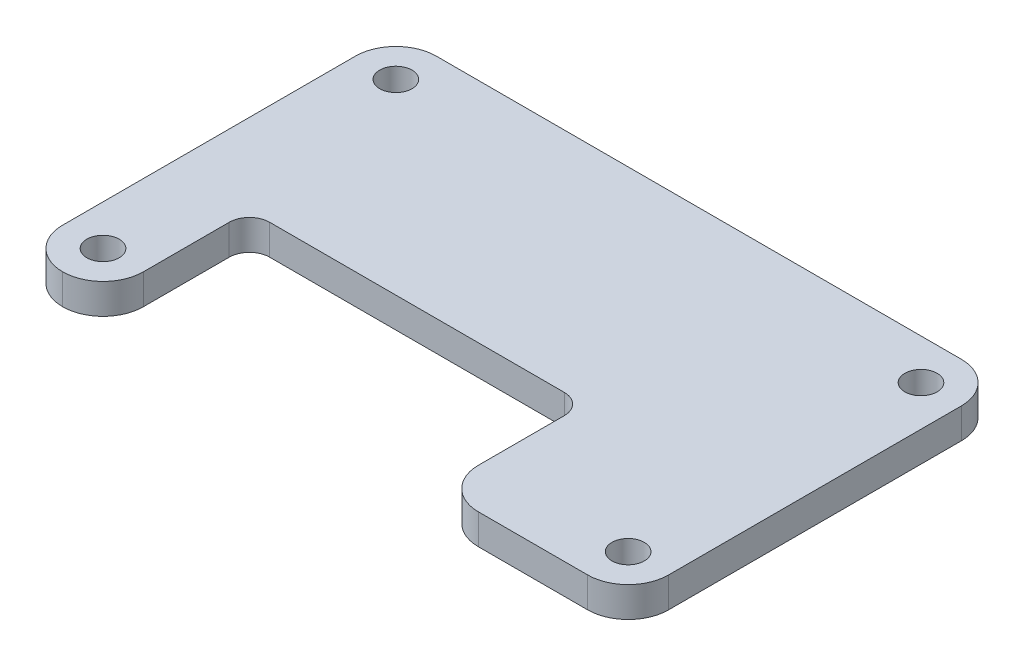
ISO-10303-21;
HEADER;
FILE_DESCRIPTION(('STEP AP214'),'2;1');
FILE_NAME('part.step','',(''),(''),'','','');
FILE_SCHEMA(('AUTOMOTIVE_DESIGN { 1 0 10303 214 1 1 1 1 }'));
ENDSEC;
DATA;
#1=APPLICATION_CONTEXT('core data for automotive mechanical design processes');
#2=APPLICATION_PROTOCOL_DEFINITION('international standard','automotive_design',2000,#1);
#3=PRODUCT_CONTEXT('',#1,'mechanical');
#4=PRODUCT('Part','Part','',(#3));
#5=PRODUCT_RELATED_PRODUCT_CATEGORY('part','',(#4));
#6=PRODUCT_DEFINITION_FORMATION('','',#4);
#7=PRODUCT_DEFINITION_CONTEXT('part definition',#1,'design');
#8=PRODUCT_DEFINITION('design','',#6,#7);
#9=PRODUCT_DEFINITION_SHAPE('','',#8);
#10=(LENGTH_UNIT() NAMED_UNIT(*) SI_UNIT(.MILLI.,.METRE.));
#11=(NAMED_UNIT(*) PLANE_ANGLE_UNIT() SI_UNIT($,.RADIAN.));
#12=(NAMED_UNIT(*) SI_UNIT($,.STERADIAN.) SOLID_ANGLE_UNIT());
#13=UNCERTAINTY_MEASURE_WITH_UNIT(LENGTH_MEASURE(1.E-05),#10,'distance_accuracy_value','');
#14=(GEOMETRIC_REPRESENTATION_CONTEXT(3) GLOBAL_UNCERTAINTY_ASSIGNED_CONTEXT((#13)) GLOBAL_UNIT_ASSIGNED_CONTEXT((#10,
#11,#12)) REPRESENTATION_CONTEXT('',''));
#15=CARTESIAN_POINT('',(0.,0.,0.));
#16=DIRECTION('',(0.,0.,1.));
#17=DIRECTION('',(1.,0.,0.));
#18=AXIS2_PLACEMENT_3D('',#15,#16,#17);
#19=CARTESIAN_POINT('',(-30.,2.9972,18.5));
#20=DIRECTION('',(0.,0.,-1.));
#21=DIRECTION('',(-1.,0.,0.));
#22=AXIS2_PLACEMENT_3D('',#19,#20,#21);
#23=PLANE('',#22);
#24=DIRECTION('',(1.,0.,0.));
#25=VECTOR('',#24,1.);
#26=CARTESIAN_POINT('',(-30.,2.9972,18.5));
#27=LINE('',#26,#25);
#28=CARTESIAN_POINT('',(15.176,2.9972,18.5));
#29=VERTEX_POINT('',#28);
#30=CARTESIAN_POINT('',(26.,2.9972,18.5));
#31=VERTEX_POINT('',#30);
#32=EDGE_CURVE('E175',#29,#31,#27,.T.);
#33=ORIENTED_EDGE('',*,*,#32,.F.);
#34=DIRECTION('',(0.,1.,0.));
#35=VECTOR('',#34,1.);
#36=CARTESIAN_POINT('',(15.176,2.9972,18.5));
#37=LINE('',#36,#35);
#38=CARTESIAN_POINT('',(15.176,0.,18.5));
#39=VERTEX_POINT('',#38);
#40=EDGE_CURVE('E213',#29,#39,#37,.F.);
#41=ORIENTED_EDGE('',*,*,#40,.T.);
#42=DIRECTION('',(1.,0.,0.));
#43=VECTOR('',#42,1.);
#44=CARTESIAN_POINT('',(-30.,0.,18.5));
#45=LINE('',#44,#43);
#46=CARTESIAN_POINT('',(26.,0.,18.5));
#47=VERTEX_POINT('',#46);
#48=EDGE_CURVE('E166',#39,#47,#45,.T.);
#49=ORIENTED_EDGE('',*,*,#48,.T.);
#50=DIRECTION('',(0.,-1.,0.));
#51=VECTOR('',#50,1.);
#52=CARTESIAN_POINT('',(26.,2.9972,18.5));
#53=LINE('',#52,#51);
#54=EDGE_CURVE('E202',#47,#31,#53,.F.);
#55=ORIENTED_EDGE('',*,*,#54,.T.);
#56=EDGE_LOOP('',(#33,#41,#49,#55));
#57=FACE_BOUND('',#56,.T.);
#58=ADVANCED_FACE('F33',(#57),#23,.F.);
#59=CARTESIAN_POINT('',(30.,2.9972,18.5));
#60=DIRECTION('',(-1.,0.,0.));
#61=DIRECTION('',(0.,0.,1.));
#62=AXIS2_PLACEMENT_3D('',#59,#60,#61);
#63=PLANE('',#62);
#64=DIRECTION('',(0.,0.,-1.));
#65=VECTOR('',#64,1.);
#66=CARTESIAN_POINT('',(30.,0.,18.5));
#67=LINE('',#66,#65);
#68=CARTESIAN_POINT('',(30.,0.,14.5));
#69=VERTEX_POINT('',#68);
#70=CARTESIAN_POINT('',(30.,0.,-14.5));
#71=VERTEX_POINT('',#70);
#72=EDGE_CURVE('E171',#69,#71,#67,.T.);
#73=ORIENTED_EDGE('',*,*,#72,.T.);
#74=DIRECTION('',(0.,-1.,0.));
#75=VECTOR('',#74,1.);
#76=CARTESIAN_POINT('',(30.,2.9972,-14.5));
#77=LINE('',#76,#75);
#78=CARTESIAN_POINT('',(30.,2.9972,-14.5));
#79=VERTEX_POINT('',#78);
#80=EDGE_CURVE('E197',#71,#79,#77,.F.);
#81=ORIENTED_EDGE('',*,*,#80,.T.);
#82=DIRECTION('',(0.,0.,-1.));
#83=VECTOR('',#82,1.);
#84=CARTESIAN_POINT('',(30.,2.9972,18.5));
#85=LINE('',#84,#83);
#86=CARTESIAN_POINT('',(30.,2.9972,14.5));
#87=VERTEX_POINT('',#86);
#88=EDGE_CURVE('E169',#87,#79,#85,.T.);
#89=ORIENTED_EDGE('',*,*,#88,.F.);
#90=DIRECTION('',(0.,-1.,0.));
#91=VECTOR('',#90,1.);
#92=CARTESIAN_POINT('',(30.,2.9972,14.5));
#93=LINE('',#92,#91);
#94=EDGE_CURVE('E194',#87,#69,#93,.T.);
#95=ORIENTED_EDGE('',*,*,#94,.T.);
#96=EDGE_LOOP('',(#73,#81,#89,#95));
#97=FACE_BOUND('',#96,.T.);
#98=ADVANCED_FACE('F296',(#97),#63,.F.);
#99=CARTESIAN_POINT('',(-30.,2.9972,-18.5));
#100=DIRECTION('',(0.,0.,1.));
#101=DIRECTION('',(1.,0.,0.));
#102=AXIS2_PLACEMENT_3D('',#99,#100,#101);
#103=PLANE('',#102);
#104=DIRECTION('',(-1.,0.,0.));
#105=VECTOR('',#104,1.);
#106=CARTESIAN_POINT('',(-30.,0.,-18.5));
#107=LINE('',#106,#105);
#108=CARTESIAN_POINT('',(26.,0.,-18.5));
#109=VERTEX_POINT('',#108);
#110=CARTESIAN_POINT('',(-26.,0.,-18.5));
#111=VERTEX_POINT('',#110);
#112=EDGE_CURVE('E167',#109,#111,#107,.T.);
#113=ORIENTED_EDGE('',*,*,#112,.T.);
#114=DIRECTION('',(0.,-1.,0.));
#115=VECTOR('',#114,1.);
#116=CARTESIAN_POINT('',(-26.,2.9972,-18.5));
#117=LINE('',#116,#115);
#118=CARTESIAN_POINT('',(-26.,2.9972,-18.5));
#119=VERTEX_POINT('',#118);
#120=EDGE_CURVE('E144',#111,#119,#117,.F.);
#121=ORIENTED_EDGE('',*,*,#120,.T.);
#122=DIRECTION('',(-1.,0.,0.));
#123=VECTOR('',#122,1.);
#124=CARTESIAN_POINT('',(-30.,2.9972,-18.5));
#125=LINE('',#124,#123);
#126=CARTESIAN_POINT('',(26.,2.9972,-18.5));
#127=VERTEX_POINT('',#126);
#128=EDGE_CURVE('E288',#127,#119,#125,.T.);
#129=ORIENTED_EDGE('',*,*,#128,.F.);
#130=DIRECTION('',(0.,-1.,0.));
#131=VECTOR('',#130,1.);
#132=CARTESIAN_POINT('',(26.,2.9972,-18.5));
#133=LINE('',#132,#131);
#134=EDGE_CURVE('E148',#127,#109,#133,.T.);
#135=ORIENTED_EDGE('',*,*,#134,.T.);
#136=EDGE_LOOP('',(#113,#121,#129,#135));
#137=FACE_BOUND('',#136,.T.);
#138=ADVANCED_FACE('F305',(#137),#103,.F.);
#139=CARTESIAN_POINT('',(-30.,2.9972,18.5));
#140=DIRECTION('',(1.,0.,0.));
#141=DIRECTION('',(0.,0.,-1.));
#142=AXIS2_PLACEMENT_3D('',#139,#140,#141);
#143=PLANE('',#142);
#144=DIRECTION('',(0.,0.,1.));
#145=VECTOR('',#144,1.);
#146=CARTESIAN_POINT('',(-30.,2.9972,18.5));
#147=LINE('',#146,#145);
#148=CARTESIAN_POINT('',(-30.,2.9972,-14.5));
#149=VERTEX_POINT('',#148);
#150=CARTESIAN_POINT('',(-30.,2.9972,14.5));
#151=VERTEX_POINT('',#150);
#152=EDGE_CURVE('E158',#149,#151,#147,.T.);
#153=ORIENTED_EDGE('',*,*,#152,.F.);
#154=DIRECTION('',(0.,-1.,0.));
#155=VECTOR('',#154,1.);
#156=CARTESIAN_POINT('',(-30.,2.9972,-14.5));
#157=LINE('',#156,#155);
#158=CARTESIAN_POINT('',(-30.,0.,-14.5));
#159=VERTEX_POINT('',#158);
#160=EDGE_CURVE('E143',#149,#159,#157,.T.);
#161=ORIENTED_EDGE('',*,*,#160,.T.);
#162=DIRECTION('',(0.,0.,1.));
#163=VECTOR('',#162,1.);
#164=CARTESIAN_POINT('',(-30.,0.,18.5));
#165=LINE('',#164,#163);
#166=CARTESIAN_POINT('',(-30.,0.,14.5));
#167=VERTEX_POINT('',#166);
#168=EDGE_CURVE('E155',#159,#167,#165,.T.);
#169=ORIENTED_EDGE('',*,*,#168,.T.);
#170=DIRECTION('',(0.,-1.,0.));
#171=VECTOR('',#170,1.);
#172=CARTESIAN_POINT('',(-30.,2.9972,14.5));
#173=LINE('',#172,#171);
#174=EDGE_CURVE('E160',#167,#151,#173,.F.);
#175=ORIENTED_EDGE('',*,*,#174,.T.);
#176=EDGE_LOOP('',(#153,#161,#169,#175));
#177=FACE_BOUND('',#176,.T.);
#178=ADVANCED_FACE('F154',(#177),#143,.F.);
#179=CARTESIAN_POINT('',(30.,2.9972,-18.5));
#180=DIRECTION('',(0.,-1.,0.));
#181=DIRECTION('',(0.,0.,-1.));
#182=AXIS2_PLACEMENT_3D('',#179,#180,#181);
#183=PLANE('',#182);
#184=CARTESIAN_POINT('',(26.,2.9972,-14.5));
#185=DIRECTION('',(0.,1.,0.));
#186=DIRECTION('',(0.,0.,1.));
#187=AXIS2_PLACEMENT_3D('',#184,#185,#186);
#188=CIRCLE('',#187,1.6);
#189=CARTESIAN_POINT('',(26.,2.9972,-12.9));
#190=VERTEX_POINT('',#189);
#191=EDGE_CURVE('E253',#190,#190,#188,.T.);
#192=ORIENTED_EDGE('',*,*,#191,.F.);
#193=EDGE_LOOP('',(#192));
#194=FACE_BOUND('',#193,.T.);
#195=CARTESIAN_POINT('',(26.,2.9972,14.5));
#196=DIRECTION('',(0.,1.,0.));
#197=DIRECTION('',(0.,0.,1.));
#198=AXIS2_PLACEMENT_3D('',#195,#196,#197);
#199=CIRCLE('',#198,1.6);
#200=CARTESIAN_POINT('',(26.,2.9972,16.1));
#201=VERTEX_POINT('',#200);
#202=EDGE_CURVE('E267',#201,#201,#199,.T.);
#203=ORIENTED_EDGE('',*,*,#202,.F.);
#204=EDGE_LOOP('',(#203));
#205=FACE_BOUND('',#204,.T.);
#206=CARTESIAN_POINT('',(-26.,2.9972,14.5));
#207=DIRECTION('',(0.,1.,0.));
#208=DIRECTION('',(0.,0.,1.));
#209=AXIS2_PLACEMENT_3D('',#206,#207,#208);
#210=CIRCLE('',#209,1.6);
#211=CARTESIAN_POINT('',(-26.,2.9972,16.1));
#212=VERTEX_POINT('',#211);
#213=EDGE_CURVE('E272',#212,#212,#210,.T.);
#214=ORIENTED_EDGE('',*,*,#213,.F.);
#215=EDGE_LOOP('',(#214));
#216=FACE_BOUND('',#215,.T.);
#217=CARTESIAN_POINT('',(-26.,2.9972,-14.5));
#218=DIRECTION('',(0.,1.,0.));
#219=DIRECTION('',(0.,0.,1.));
#220=AXIS2_PLACEMENT_3D('',#217,#218,#219);
#221=CIRCLE('',#220,1.6);
#222=CARTESIAN_POINT('',(-26.,2.9972,-12.9));
#223=VERTEX_POINT('',#222);
#224=EDGE_CURVE('E278',#223,#223,#221,.T.);
#225=ORIENTED_EDGE('',*,*,#224,.F.);
#226=EDGE_LOOP('',(#225));
#227=FACE_BOUND('',#226,.T.);
#228=DIRECTION('',(0.,0.,-1.));
#229=VECTOR('',#228,1.);
#230=CARTESIAN_POINT('',(11.176,2.9972,4.));
#231=LINE('',#230,#229);
#232=CARTESIAN_POINT('',(11.176,2.9972,14.5));
#233=VERTEX_POINT('',#232);
#234=CARTESIAN_POINT('',(11.176,2.9972,6.));
#235=VERTEX_POINT('',#234);
#236=EDGE_CURVE('E246',#233,#235,#231,.T.);
#237=ORIENTED_EDGE('',*,*,#236,.F.);
#238=CARTESIAN_POINT('',(15.176,2.9972,14.5));
#239=DIRECTION('',(0.,-1.,0.));
#240=DIRECTION('',(0.,0.,-1.));
#241=AXIS2_PLACEMENT_3D('',#238,#239,#240);
#242=CIRCLE('',#241,4.);
#243=EDGE_CURVE('E211',#233,#29,#242,.F.);
#244=ORIENTED_EDGE('',*,*,#243,.T.);
#245=ORIENTED_EDGE('',*,*,#32,.T.);
#246=CARTESIAN_POINT('',(26.,2.9972,14.5));
#247=DIRECTION('',(0.,-1.,0.));
#248=DIRECTION('',(0.,0.,-1.));
#249=AXIS2_PLACEMENT_3D('',#246,#247,#248);
#250=CIRCLE('',#249,4.);
#251=EDGE_CURVE('E188',#31,#87,#250,.F.);
#252=ORIENTED_EDGE('',*,*,#251,.T.);
#253=ORIENTED_EDGE('',*,*,#88,.T.);
#254=CARTESIAN_POINT('',(26.,2.9972,-14.5));
#255=DIRECTION('',(0.,-1.,0.));
#256=DIRECTION('',(0.,0.,-1.));
#257=AXIS2_PLACEMENT_3D('',#254,#255,#256);
#258=CIRCLE('',#257,4.);
#259=EDGE_CURVE('E190',#79,#127,#258,.F.);
#260=ORIENTED_EDGE('',*,*,#259,.T.);
#261=ORIENTED_EDGE('',*,*,#128,.T.);
#262=CARTESIAN_POINT('',(-26.,2.9972,-14.5));
#263=DIRECTION('',(0.,-1.,0.));
#264=DIRECTION('',(0.,0.,-1.));
#265=AXIS2_PLACEMENT_3D('',#262,#263,#264);
#266=CIRCLE('',#265,4.);
#267=EDGE_CURVE('E192',#119,#149,#266,.F.);
#268=ORIENTED_EDGE('',*,*,#267,.T.);
#269=ORIENTED_EDGE('',*,*,#152,.T.);
#270=CARTESIAN_POINT('',(-26.,2.9972,14.5));
#271=DIRECTION('',(0.,-1.,0.));
#272=DIRECTION('',(0.,0.,-1.));
#273=AXIS2_PLACEMENT_3D('',#270,#271,#272);
#274=CIRCLE('',#273,4.);
#275=CARTESIAN_POINT('',(-26.,2.9972,18.5));
#276=VERTEX_POINT('',#275);
#277=EDGE_CURVE('E185',#151,#276,#274,.F.);
#278=ORIENTED_EDGE('',*,*,#277,.T.);
#279=CARTESIAN_POINT('',(-26.,2.9972,14.5));
#280=DIRECTION('',(0.,-1.,0.));
#281=DIRECTION('',(0.,0.,-1.));
#282=AXIS2_PLACEMENT_3D('',#279,#280,#281);
#283=CIRCLE('',#282,4.);
#284=CARTESIAN_POINT('',(-22.,2.9972,14.5));
#285=VERTEX_POINT('',#284);
#286=EDGE_CURVE('E208',#276,#285,#283,.F.);
#287=ORIENTED_EDGE('',*,*,#286,.T.);
#288=DIRECTION('',(0.,0.,1.));
#289=VECTOR('',#288,1.);
#290=CARTESIAN_POINT('',(-22.,2.9972,4.));
#291=LINE('',#290,#289);
#292=CARTESIAN_POINT('',(-22.,2.9972,6.));
#293=VERTEX_POINT('',#292);
#294=EDGE_CURVE('E241',#293,#285,#291,.T.);
#295=ORIENTED_EDGE('',*,*,#294,.F.);
#296=CARTESIAN_POINT('',(-20.,2.9972,6.));
#297=DIRECTION('',(0.,-1.,0.));
#298=DIRECTION('',(0.,0.,-1.));
#299=AXIS2_PLACEMENT_3D('',#296,#297,#298);
#300=CIRCLE('',#299,2.);
#301=CARTESIAN_POINT('',(-20.,2.9972,4.));
#302=VERTEX_POINT('',#301);
#303=EDGE_CURVE('E41',#293,#302,#300,.T.);
#304=ORIENTED_EDGE('',*,*,#303,.T.);
#305=DIRECTION('',(-1.,0.,0.));
#306=VECTOR('',#305,1.);
#307=CARTESIAN_POINT('',(-22.,2.9972,4.));
#308=LINE('',#307,#306);
#309=CARTESIAN_POINT('',(9.176,2.9972,4.));
#310=VERTEX_POINT('',#309);
#311=EDGE_CURVE('E240',#310,#302,#308,.T.);
#312=ORIENTED_EDGE('',*,*,#311,.F.);
#313=CARTESIAN_POINT('',(9.176,2.9972,6.));
#314=DIRECTION('',(0.,-1.,0.));
#315=DIRECTION('',(0.,0.,-1.));
#316=AXIS2_PLACEMENT_3D('',#313,#314,#315);
#317=CIRCLE('',#316,2.);
#318=EDGE_CURVE('E231',#310,#235,#317,.T.);
#319=ORIENTED_EDGE('',*,*,#318,.T.);
#320=EDGE_LOOP('',(#237,#244,#245,#252,#253,#260,#261,#268,#269,#278,#287,#295,#304,#312,#319));
#321=FACE_BOUND('',#320,.T.);
#322=ADVANCED_FACE('F239',(#194,#205,#216,#227,#321),#183,.F.);
#323=CARTESIAN_POINT('',(30.,0.,-18.5));
#324=DIRECTION('',(0.,-1.,0.));
#325=DIRECTION('',(0.,0.,-1.));
#326=AXIS2_PLACEMENT_3D('',#323,#324,#325);
#327=PLANE('',#326);
#328=ORIENTED_EDGE('',*,*,#48,.F.);
#329=CARTESIAN_POINT('',(15.176,0.,14.5));
#330=DIRECTION('',(0.,-1.,0.));
#331=DIRECTION('',(0.,0.,-1.));
#332=AXIS2_PLACEMENT_3D('',#329,#330,#331);
#333=CIRCLE('',#332,4.);
#334=CARTESIAN_POINT('',(11.176,0.,14.5));
#335=VERTEX_POINT('',#334);
#336=EDGE_CURVE('E217',#39,#335,#333,.T.);
#337=ORIENTED_EDGE('',*,*,#336,.T.);
#338=DIRECTION('',(0.,0.,-1.));
#339=VECTOR('',#338,1.);
#340=CARTESIAN_POINT('',(11.176,0.,4.));
#341=LINE('',#340,#339);
#342=CARTESIAN_POINT('',(11.176,0.,6.));
#343=VERTEX_POINT('',#342);
#344=EDGE_CURVE('E259',#335,#343,#341,.T.);
#345=ORIENTED_EDGE('',*,*,#344,.T.);
#346=CARTESIAN_POINT('',(9.176,0.,6.));
#347=DIRECTION('',(0.,-1.,0.));
#348=DIRECTION('',(0.,0.,-1.));
#349=AXIS2_PLACEMENT_3D('',#346,#347,#348);
#350=CIRCLE('',#349,2.);
#351=CARTESIAN_POINT('',(9.176,0.,4.));
#352=VERTEX_POINT('',#351);
#353=EDGE_CURVE('E233',#343,#352,#350,.F.);
#354=ORIENTED_EDGE('',*,*,#353,.T.);
#355=DIRECTION('',(-1.,0.,0.));
#356=VECTOR('',#355,1.);
#357=CARTESIAN_POINT('',(-22.,0.,4.));
#358=LINE('',#357,#356);
#359=CARTESIAN_POINT('',(-20.,0.,4.));
#360=VERTEX_POINT('',#359);
#361=EDGE_CURVE('E254',#352,#360,#358,.T.);
#362=ORIENTED_EDGE('',*,*,#361,.T.);
#363=CARTESIAN_POINT('',(-20.,0.,6.));
#364=DIRECTION('',(0.,-1.,0.));
#365=DIRECTION('',(0.,0.,-1.));
#366=AXIS2_PLACEMENT_3D('',#363,#364,#365);
#367=CIRCLE('',#366,2.);
#368=CARTESIAN_POINT('',(-22.,0.,6.));
#369=VERTEX_POINT('',#368);
#370=EDGE_CURVE('E11',#360,#369,#367,.F.);
#371=ORIENTED_EDGE('',*,*,#370,.T.);
#372=DIRECTION('',(0.,0.,1.));
#373=VECTOR('',#372,1.);
#374=CARTESIAN_POINT('',(-22.,0.,4.));
#375=LINE('',#374,#373);
#376=CARTESIAN_POINT('',(-22.,0.,14.5));
#377=VERTEX_POINT('',#376);
#378=EDGE_CURVE('E250',#369,#377,#375,.T.);
#379=ORIENTED_EDGE('',*,*,#378,.T.);
#380=CARTESIAN_POINT('',(-26.,0.,14.5));
#381=DIRECTION('',(0.,-1.,0.));
#382=DIRECTION('',(0.,0.,-1.));
#383=AXIS2_PLACEMENT_3D('',#380,#381,#382);
#384=CIRCLE('',#383,4.);
#385=CARTESIAN_POINT('',(-26.,0.,18.5));
#386=VERTEX_POINT('',#385);
#387=EDGE_CURVE('E215',#377,#386,#384,.T.);
#388=ORIENTED_EDGE('',*,*,#387,.T.);
#389=CARTESIAN_POINT('',(-26.,0.,14.5));
#390=DIRECTION('',(0.,-1.,0.));
#391=DIRECTION('',(0.,0.,-1.));
#392=AXIS2_PLACEMENT_3D('',#389,#390,#391);
#393=CIRCLE('',#392,4.);
#394=EDGE_CURVE('E159',#386,#167,#393,.T.);
#395=ORIENTED_EDGE('',*,*,#394,.T.);
#396=ORIENTED_EDGE('',*,*,#168,.F.);
#397=CARTESIAN_POINT('',(-26.,0.,-14.5));
#398=DIRECTION('',(0.,-1.,0.));
#399=DIRECTION('',(0.,0.,-1.));
#400=AXIS2_PLACEMENT_3D('',#397,#398,#399);
#401=CIRCLE('',#400,4.);
#402=EDGE_CURVE('E139',#159,#111,#401,.T.);
#403=ORIENTED_EDGE('',*,*,#402,.T.);
#404=ORIENTED_EDGE('',*,*,#112,.F.);
#405=CARTESIAN_POINT('',(26.,0.,-14.5));
#406=DIRECTION('',(0.,-1.,0.));
#407=DIRECTION('',(0.,0.,-1.));
#408=AXIS2_PLACEMENT_3D('',#405,#406,#407);
#409=CIRCLE('',#408,4.);
#410=EDGE_CURVE('E149',#109,#71,#409,.T.);
#411=ORIENTED_EDGE('',*,*,#410,.T.);
#412=ORIENTED_EDGE('',*,*,#72,.F.);
#413=CARTESIAN_POINT('',(26.,0.,14.5));
#414=DIRECTION('',(0.,-1.,0.));
#415=DIRECTION('',(0.,0.,-1.));
#416=AXIS2_PLACEMENT_3D('',#413,#414,#415);
#417=CIRCLE('',#416,4.);
#418=EDGE_CURVE('E178',#69,#47,#417,.T.);
#419=ORIENTED_EDGE('',*,*,#418,.T.);
#420=EDGE_LOOP('',(#328,#337,#345,#354,#362,#371,#379,#388,#395,#396,#403,#404,#411,#412,#419));
#421=FACE_BOUND('',#420,.T.);
#422=CARTESIAN_POINT('',(26.,0.,-14.5));
#423=DIRECTION('',(0.,1.,0.));
#424=DIRECTION('',(0.,0.,1.));
#425=AXIS2_PLACEMENT_3D('',#422,#423,#424);
#426=CIRCLE('',#425,1.6);
#427=CARTESIAN_POINT('',(26.,0.,-12.9));
#428=VERTEX_POINT('',#427);
#429=EDGE_CURVE('E257',#428,#428,#426,.T.);
#430=ORIENTED_EDGE('',*,*,#429,.T.);
#431=EDGE_LOOP('',(#430));
#432=FACE_BOUND('',#431,.T.);
#433=CARTESIAN_POINT('',(26.,0.,14.5));
#434=DIRECTION('',(0.,1.,0.));
#435=DIRECTION('',(0.,0.,1.));
#436=AXIS2_PLACEMENT_3D('',#433,#434,#435);
#437=CIRCLE('',#436,1.6);
#438=CARTESIAN_POINT('',(26.,0.,16.1));
#439=VERTEX_POINT('',#438);
#440=EDGE_CURVE('E269',#439,#439,#437,.T.);
#441=ORIENTED_EDGE('',*,*,#440,.T.);
#442=EDGE_LOOP('',(#441));
#443=FACE_BOUND('',#442,.T.);
#444=CARTESIAN_POINT('',(-26.,0.,14.5));
#445=DIRECTION('',(0.,1.,0.));
#446=DIRECTION('',(0.,0.,1.));
#447=AXIS2_PLACEMENT_3D('',#444,#445,#446);
#448=CIRCLE('',#447,1.6);
#449=CARTESIAN_POINT('',(-26.,0.,16.1));
#450=VERTEX_POINT('',#449);
#451=EDGE_CURVE('E275',#450,#450,#448,.T.);
#452=ORIENTED_EDGE('',*,*,#451,.T.);
#453=EDGE_LOOP('',(#452));
#454=FACE_BOUND('',#453,.T.);
#455=CARTESIAN_POINT('',(-26.,0.,-14.5));
#456=DIRECTION('',(0.,1.,0.));
#457=DIRECTION('',(0.,0.,1.));
#458=AXIS2_PLACEMENT_3D('',#455,#456,#457);
#459=CIRCLE('',#458,1.6);
#460=CARTESIAN_POINT('',(-26.,0.,-12.9));
#461=VERTEX_POINT('',#460);
#462=EDGE_CURVE('E281',#461,#461,#459,.T.);
#463=ORIENTED_EDGE('',*,*,#462,.T.);
#464=EDGE_LOOP('',(#463));
#465=FACE_BOUND('',#464,.T.);
#466=ADVANCED_FACE('F163',(#421,#432,#443,#454,#465),#327,.T.);
#467=CARTESIAN_POINT('',(-26.,2.9972,-14.5));
#468=DIRECTION('',(0.,-1.,0.));
#469=DIRECTION('',(0.,0.,-1.));
#470=AXIS2_PLACEMENT_3D('',#467,#468,#469);
#471=CYLINDRICAL_SURFACE('',#470,4.);
#472=ORIENTED_EDGE('',*,*,#267,.F.);
#473=ORIENTED_EDGE('',*,*,#120,.F.);
#474=ORIENTED_EDGE('',*,*,#402,.F.);
#475=ORIENTED_EDGE('',*,*,#160,.F.);
#476=EDGE_LOOP('',(#472,#473,#474,#475));
#477=FACE_BOUND('',#476,.T.);
#478=ADVANCED_FACE('F142',(#477),#471,.T.);
#479=CARTESIAN_POINT('',(26.,2.9972,-14.5));
#480=DIRECTION('',(0.,-1.,0.));
#481=DIRECTION('',(0.,0.,-1.));
#482=AXIS2_PLACEMENT_3D('',#479,#480,#481);
#483=CYLINDRICAL_SURFACE('',#482,4.);
#484=ORIENTED_EDGE('',*,*,#259,.F.);
#485=ORIENTED_EDGE('',*,*,#80,.F.);
#486=ORIENTED_EDGE('',*,*,#410,.F.);
#487=ORIENTED_EDGE('',*,*,#134,.F.);
#488=EDGE_LOOP('',(#484,#485,#486,#487));
#489=FACE_BOUND('',#488,.T.);
#490=ADVANCED_FACE('F301',(#489),#483,.T.);
#491=CARTESIAN_POINT('',(26.,2.9972,14.5));
#492=DIRECTION('',(0.,-1.,0.));
#493=DIRECTION('',(0.,0.,-1.));
#494=AXIS2_PLACEMENT_3D('',#491,#492,#493);
#495=CYLINDRICAL_SURFACE('',#494,4.);
#496=ORIENTED_EDGE('',*,*,#251,.F.);
#497=ORIENTED_EDGE('',*,*,#54,.F.);
#498=ORIENTED_EDGE('',*,*,#418,.F.);
#499=ORIENTED_EDGE('',*,*,#94,.F.);
#500=EDGE_LOOP('',(#496,#497,#498,#499));
#501=FACE_BOUND('',#500,.T.);
#502=ADVANCED_FACE('F437',(#501),#495,.T.);
#503=CARTESIAN_POINT('',(-26.,2.9972,14.5));
#504=DIRECTION('',(0.,-1.,0.));
#505=DIRECTION('',(0.,0.,-1.));
#506=AXIS2_PLACEMENT_3D('',#503,#504,#505);
#507=CYLINDRICAL_SURFACE('',#506,4.);
#508=ORIENTED_EDGE('',*,*,#277,.F.);
#509=ORIENTED_EDGE('',*,*,#174,.F.);
#510=ORIENTED_EDGE('',*,*,#394,.F.);
#511=DIRECTION('',(0.,-1.,0.));
#512=VECTOR('',#511,1.);
#513=CARTESIAN_POINT('',(-26.,2.9972,18.5));
#514=LINE('',#513,#512);
#515=EDGE_CURVE('E199',#276,#386,#514,.T.);
#516=ORIENTED_EDGE('',*,*,#515,.F.);
#517=EDGE_LOOP('',(#508,#509,#510,#516));
#518=FACE_BOUND('',#517,.T.);
#519=ADVANCED_FACE('F330',(#518),#507,.T.);
#520=CARTESIAN_POINT('',(-26.,0.,-14.5));
#521=DIRECTION('',(0.,1.,0.));
#522=DIRECTION('',(0.,0.,1.));
#523=AXIS2_PLACEMENT_3D('',#520,#521,#522);
#524=CYLINDRICAL_SURFACE('',#523,1.6);
#525=CARTESIAN_POINT('',(-26.,0.,-12.9));
#526=CARTESIAN_POINT('',(-26.,0.0312208333333333,-12.9));
#527=CARTESIAN_POINT('',(-26.,0.0624416666666667,-12.9));
#528=CARTESIAN_POINT('',(-26.,0.124883333333333,-12.9));
#529=CARTESIAN_POINT('',(-26.,0.156104166666667,-12.9));
#530=CARTESIAN_POINT('',(-26.,0.218545833333333,-12.9));
#531=CARTESIAN_POINT('',(-26.,0.249766666666667,-12.9));
#532=CARTESIAN_POINT('',(-26.,0.312208333333333,-12.9));
#533=CARTESIAN_POINT('',(-26.,0.343429166666667,-12.9));
#534=CARTESIAN_POINT('',(-26.,0.405870833333333,-12.9));
#535=CARTESIAN_POINT('',(-26.,0.437091666666667,-12.9));
#536=CARTESIAN_POINT('',(-26.,0.499533333333333,-12.9));
#537=CARTESIAN_POINT('',(-26.,0.530754166666667,-12.9));
#538=CARTESIAN_POINT('',(-26.,0.593195833333333,-12.9));
#539=CARTESIAN_POINT('',(-26.,0.624416666666667,-12.9));
#540=CARTESIAN_POINT('',(-26.,0.686858333333333,-12.9));
#541=CARTESIAN_POINT('',(-26.,0.718079166666667,-12.9));
#542=CARTESIAN_POINT('',(-26.,0.780520833333333,-12.9));
#543=CARTESIAN_POINT('',(-26.,0.811741666666667,-12.9));
#544=CARTESIAN_POINT('',(-26.,0.874183333333333,-12.9));
#545=CARTESIAN_POINT('',(-26.,0.905404166666667,-12.9));
#546=CARTESIAN_POINT('',(-26.,0.967845833333333,-12.9));
#547=CARTESIAN_POINT('',(-26.,0.999066666666667,-12.9));
#548=CARTESIAN_POINT('',(-26.,1.06150833333333,-12.9));
#549=CARTESIAN_POINT('',(-26.,1.09272916666667,-12.9));
#550=CARTESIAN_POINT('',(-26.,1.15517083333333,-12.9));
#551=CARTESIAN_POINT('',(-26.,1.18639166666667,-12.9));
#552=CARTESIAN_POINT('',(-26.,1.24883333333333,-12.9));
#553=CARTESIAN_POINT('',(-26.,1.28005416666667,-12.9));
#554=CARTESIAN_POINT('',(-26.,1.34249583333333,-12.9));
#555=CARTESIAN_POINT('',(-26.,1.37371666666667,-12.9));
#556=CARTESIAN_POINT('',(-26.,1.43615833333333,-12.9));
#557=CARTESIAN_POINT('',(-26.,1.46737916666667,-12.9));
#558=CARTESIAN_POINT('',(-26.,1.52982083333333,-12.9));
#559=CARTESIAN_POINT('',(-26.,1.56104166666667,-12.9));
#560=CARTESIAN_POINT('',(-26.,1.62348333333333,-12.9));
#561=CARTESIAN_POINT('',(-26.,1.65470416666667,-12.9));
#562=CARTESIAN_POINT('',(-26.,1.71714583333333,-12.9));
#563=CARTESIAN_POINT('',(-26.,1.74836666666667,-12.9));
#564=CARTESIAN_POINT('',(-26.,1.81080833333333,-12.9));
#565=CARTESIAN_POINT('',(-26.,1.84202916666667,-12.9));
#566=CARTESIAN_POINT('',(-26.,1.90447083333333,-12.9));
#567=CARTESIAN_POINT('',(-26.,1.93569166666667,-12.9));
#568=CARTESIAN_POINT('',(-26.,1.99813333333333,-12.9));
#569=CARTESIAN_POINT('',(-26.,2.02935416666667,-12.9));
#570=CARTESIAN_POINT('',(-26.,2.09179583333333,-12.9));
#571=CARTESIAN_POINT('',(-26.,2.12301666666667,-12.9));
#572=CARTESIAN_POINT('',(-26.,2.18545833333333,-12.9));
#573=CARTESIAN_POINT('',(-26.,2.21667916666667,-12.9));
#574=CARTESIAN_POINT('',(-26.,2.27912083333333,-12.9));
#575=CARTESIAN_POINT('',(-26.,2.31034166666667,-12.9));
#576=CARTESIAN_POINT('',(-26.,2.37278333333333,-12.9));
#577=CARTESIAN_POINT('',(-26.,2.40400416666667,-12.9));
#578=CARTESIAN_POINT('',(-26.,2.46644583333333,-12.9));
#579=CARTESIAN_POINT('',(-26.,2.49766666666667,-12.9));
#580=CARTESIAN_POINT('',(-26.,2.56010833333333,-12.9));
#581=CARTESIAN_POINT('',(-26.,2.59132916666667,-12.9));
#582=CARTESIAN_POINT('',(-26.,2.65377083333333,-12.9));
#583=CARTESIAN_POINT('',(-26.,2.68499166666667,-12.9));
#584=CARTESIAN_POINT('',(-26.,2.74743333333333,-12.9));
#585=CARTESIAN_POINT('',(-26.,2.77865416666667,-12.9));
#586=CARTESIAN_POINT('',(-26.,2.84109583333333,-12.9));
#587=CARTESIAN_POINT('',(-26.,2.87231666666667,-12.9));
#588=CARTESIAN_POINT('',(-26.,2.93475833333333,-12.9));
#589=CARTESIAN_POINT('',(-26.,2.96597916666667,-12.9));
#590=CARTESIAN_POINT('',(-26.,2.9972,-12.9));
#591=B_SPLINE_CURVE_WITH_KNOTS('',3,(#525,#526,#527,#528,#529,#530,#531,#532,#533,#534,#535,
#536,#537,#538,#539,#540,#541,#542,#543,#544,#545,#546,#547,#548,#549,#550,#551,#552,#553,#554,
#555,#556,#557,#558,#559,#560,#561,#562,#563,#564,#565,#566,#567,#568,#569,#570,#571,#572,#573,
#574,#575,#576,#577,#578,#579,#580,#581,#582,#583,#584,#585,#586,#587,#588,#589,#590),
.UNSPECIFIED.,.F.,.F.,(4,2,2,2,2,2,2,2,2,2,2,2,2,2,2,2,2,2,2,2,2,2,2,2,2,2,2,2,2,2,2,2,4),(0.,
0.0936625,0.187325,0.2809875,0.37465,0.4683125,0.561975,0.6556375,0.7493,0.8429625,0.936625,
1.0302875,1.12395,1.2176125,1.311275,1.4049375,1.4986,1.5922625,1.685925,1.7795875,1.87325,
1.9669125,2.060575,2.1542375,2.2479,2.3415625,2.435225,2.5288875,2.62255,2.7162125,2.809875,
2.9035375,2.9972),.UNSPECIFIED.);
#592=EDGE_CURVE('BSEAM326',#461,#223,#591,.T.);
#593=ORIENTED_EDGE('',*,*,#462,.F.);
#594=ORIENTED_EDGE('',*,*,#224,.T.);
#595=ORIENTED_EDGE('',*,*,#592,.T.);
#596=ORIENTED_EDGE('',*,*,#592,.F.);
#597=EDGE_LOOP('',(#593,#595,#594,#596));
#598=FACE_BOUND('',#597,.T.);
#599=ADVANCED_FACE('F326',(#598),#524,.F.);
#600=CARTESIAN_POINT('',(-26.,0.,14.5));
#601=DIRECTION('',(0.,1.,0.));
#602=DIRECTION('',(0.,0.,1.));
#603=AXIS2_PLACEMENT_3D('',#600,#601,#602);
#604=CYLINDRICAL_SURFACE('',#603,1.6);
#605=CARTESIAN_POINT('',(-26.,0.,16.1));
#606=CARTESIAN_POINT('',(-26.,0.0312208333333333,16.1));
#607=CARTESIAN_POINT('',(-26.,0.0624416666666667,16.1));
#608=CARTESIAN_POINT('',(-26.,0.124883333333333,16.1));
#609=CARTESIAN_POINT('',(-26.,0.156104166666667,16.1));
#610=CARTESIAN_POINT('',(-26.,0.218545833333333,16.1));
#611=CARTESIAN_POINT('',(-26.,0.249766666666667,16.1));
#612=CARTESIAN_POINT('',(-26.,0.312208333333333,16.1));
#613=CARTESIAN_POINT('',(-26.,0.343429166666667,16.1));
#614=CARTESIAN_POINT('',(-26.,0.405870833333333,16.1));
#615=CARTESIAN_POINT('',(-26.,0.437091666666667,16.1));
#616=CARTESIAN_POINT('',(-26.,0.499533333333333,16.1));
#617=CARTESIAN_POINT('',(-26.,0.530754166666667,16.1));
#618=CARTESIAN_POINT('',(-26.,0.593195833333333,16.1));
#619=CARTESIAN_POINT('',(-26.,0.624416666666667,16.1));
#620=CARTESIAN_POINT('',(-26.,0.686858333333333,16.1));
#621=CARTESIAN_POINT('',(-26.,0.718079166666667,16.1));
#622=CARTESIAN_POINT('',(-26.,0.780520833333333,16.1));
#623=CARTESIAN_POINT('',(-26.,0.811741666666667,16.1));
#624=CARTESIAN_POINT('',(-26.,0.874183333333333,16.1));
#625=CARTESIAN_POINT('',(-26.,0.905404166666667,16.1));
#626=CARTESIAN_POINT('',(-26.,0.967845833333333,16.1));
#627=CARTESIAN_POINT('',(-26.,0.999066666666667,16.1));
#628=CARTESIAN_POINT('',(-26.,1.06150833333333,16.1));
#629=CARTESIAN_POINT('',(-26.,1.09272916666667,16.1));
#630=CARTESIAN_POINT('',(-26.,1.15517083333333,16.1));
#631=CARTESIAN_POINT('',(-26.,1.18639166666667,16.1));
#632=CARTESIAN_POINT('',(-26.,1.24883333333333,16.1));
#633=CARTESIAN_POINT('',(-26.,1.28005416666667,16.1));
#634=CARTESIAN_POINT('',(-26.,1.34249583333333,16.1));
#635=CARTESIAN_POINT('',(-26.,1.37371666666667,16.1));
#636=CARTESIAN_POINT('',(-26.,1.43615833333333,16.1));
#637=CARTESIAN_POINT('',(-26.,1.46737916666667,16.1));
#638=CARTESIAN_POINT('',(-26.,1.52982083333333,16.1));
#639=CARTESIAN_POINT('',(-26.,1.56104166666667,16.1));
#640=CARTESIAN_POINT('',(-26.,1.62348333333333,16.1));
#641=CARTESIAN_POINT('',(-26.,1.65470416666667,16.1));
#642=CARTESIAN_POINT('',(-26.,1.71714583333333,16.1));
#643=CARTESIAN_POINT('',(-26.,1.74836666666667,16.1));
#644=CARTESIAN_POINT('',(-26.,1.81080833333333,16.1));
#645=CARTESIAN_POINT('',(-26.,1.84202916666667,16.1));
#646=CARTESIAN_POINT('',(-26.,1.90447083333333,16.1));
#647=CARTESIAN_POINT('',(-26.,1.93569166666667,16.1));
#648=CARTESIAN_POINT('',(-26.,1.99813333333333,16.1));
#649=CARTESIAN_POINT('',(-26.,2.02935416666667,16.1));
#650=CARTESIAN_POINT('',(-26.,2.09179583333333,16.1));
#651=CARTESIAN_POINT('',(-26.,2.12301666666667,16.1));
#652=CARTESIAN_POINT('',(-26.,2.18545833333333,16.1));
#653=CARTESIAN_POINT('',(-26.,2.21667916666667,16.1));
#654=CARTESIAN_POINT('',(-26.,2.27912083333333,16.1));
#655=CARTESIAN_POINT('',(-26.,2.31034166666667,16.1));
#656=CARTESIAN_POINT('',(-26.,2.37278333333333,16.1));
#657=CARTESIAN_POINT('',(-26.,2.40400416666667,16.1));
#658=CARTESIAN_POINT('',(-26.,2.46644583333333,16.1));
#659=CARTESIAN_POINT('',(-26.,2.49766666666667,16.1));
#660=CARTESIAN_POINT('',(-26.,2.56010833333333,16.1));
#661=CARTESIAN_POINT('',(-26.,2.59132916666667,16.1));
#662=CARTESIAN_POINT('',(-26.,2.65377083333333,16.1));
#663=CARTESIAN_POINT('',(-26.,2.68499166666667,16.1));
#664=CARTESIAN_POINT('',(-26.,2.74743333333333,16.1));
#665=CARTESIAN_POINT('',(-26.,2.77865416666667,16.1));
#666=CARTESIAN_POINT('',(-26.,2.84109583333333,16.1));
#667=CARTESIAN_POINT('',(-26.,2.87231666666667,16.1));
#668=CARTESIAN_POINT('',(-26.,2.93475833333333,16.1));
#669=CARTESIAN_POINT('',(-26.,2.96597916666667,16.1));
#670=CARTESIAN_POINT('',(-26.,2.9972,16.1));
#671=B_SPLINE_CURVE_WITH_KNOTS('',3,(#605,#606,#607,#608,#609,#610,#611,#612,#613,#614,#615,
#616,#617,#618,#619,#620,#621,#622,#623,#624,#625,#626,#627,#628,#629,#630,#631,#632,#633,#634,
#635,#636,#637,#638,#639,#640,#641,#642,#643,#644,#645,#646,#647,#648,#649,#650,#651,#652,#653,
#654,#655,#656,#657,#658,#659,#660,#661,#662,#663,#664,#665,#666,#667,#668,#669,#670),
.UNSPECIFIED.,.F.,.F.,(4,2,2,2,2,2,2,2,2,2,2,2,2,2,2,2,2,2,2,2,2,2,2,2,2,2,2,2,2,2,2,2,4),(0.,
0.0936625,0.187325,0.2809875,0.37465,0.4683125,0.561975,0.6556375,0.7493,0.8429625,0.936625,
1.0302875,1.12395,1.2176125,1.311275,1.4049375,1.4986,1.5922625,1.685925,1.7795875,1.87325,
1.9669125,2.060575,2.1542375,2.2479,2.3415625,2.435225,2.5288875,2.62255,2.7162125,2.809875,
2.9035375,2.9972),.UNSPECIFIED.);
#672=EDGE_CURVE('BSEAM329',#450,#212,#671,.T.);
#673=ORIENTED_EDGE('',*,*,#451,.F.);
#674=ORIENTED_EDGE('',*,*,#213,.T.);
#675=ORIENTED_EDGE('',*,*,#672,.T.);
#676=ORIENTED_EDGE('',*,*,#672,.F.);
#677=EDGE_LOOP('',(#673,#675,#674,#676));
#678=FACE_BOUND('',#677,.T.);
#679=ADVANCED_FACE('F329',(#678),#604,.F.);
#680=CARTESIAN_POINT('',(26.,0.,14.5));
#681=DIRECTION('',(0.,1.,0.));
#682=DIRECTION('',(0.,0.,1.));
#683=AXIS2_PLACEMENT_3D('',#680,#681,#682);
#684=CYLINDRICAL_SURFACE('',#683,1.6);
#685=CARTESIAN_POINT('',(26.,0.,16.1));
#686=CARTESIAN_POINT('',(26.,0.0312208333333333,16.1));
#687=CARTESIAN_POINT('',(26.,0.0624416666666667,16.1));
#688=CARTESIAN_POINT('',(26.,0.124883333333333,16.1));
#689=CARTESIAN_POINT('',(26.,0.156104166666667,16.1));
#690=CARTESIAN_POINT('',(26.,0.218545833333333,16.1));
#691=CARTESIAN_POINT('',(26.,0.249766666666667,16.1));
#692=CARTESIAN_POINT('',(26.,0.312208333333333,16.1));
#693=CARTESIAN_POINT('',(26.,0.343429166666667,16.1));
#694=CARTESIAN_POINT('',(26.,0.405870833333333,16.1));
#695=CARTESIAN_POINT('',(26.,0.437091666666667,16.1));
#696=CARTESIAN_POINT('',(26.,0.499533333333333,16.1));
#697=CARTESIAN_POINT('',(26.,0.530754166666667,16.1));
#698=CARTESIAN_POINT('',(26.,0.593195833333333,16.1));
#699=CARTESIAN_POINT('',(26.,0.624416666666667,16.1));
#700=CARTESIAN_POINT('',(26.,0.686858333333333,16.1));
#701=CARTESIAN_POINT('',(26.,0.718079166666667,16.1));
#702=CARTESIAN_POINT('',(26.,0.780520833333333,16.1));
#703=CARTESIAN_POINT('',(26.,0.811741666666667,16.1));
#704=CARTESIAN_POINT('',(26.,0.874183333333333,16.1));
#705=CARTESIAN_POINT('',(26.,0.905404166666667,16.1));
#706=CARTESIAN_POINT('',(26.,0.967845833333333,16.1));
#707=CARTESIAN_POINT('',(26.,0.999066666666667,16.1));
#708=CARTESIAN_POINT('',(26.,1.06150833333333,16.1));
#709=CARTESIAN_POINT('',(26.,1.09272916666667,16.1));
#710=CARTESIAN_POINT('',(26.,1.15517083333333,16.1));
#711=CARTESIAN_POINT('',(26.,1.18639166666667,16.1));
#712=CARTESIAN_POINT('',(26.,1.24883333333333,16.1));
#713=CARTESIAN_POINT('',(26.,1.28005416666667,16.1));
#714=CARTESIAN_POINT('',(26.,1.34249583333333,16.1));
#715=CARTESIAN_POINT('',(26.,1.37371666666667,16.1));
#716=CARTESIAN_POINT('',(26.,1.43615833333333,16.1));
#717=CARTESIAN_POINT('',(26.,1.46737916666667,16.1));
#718=CARTESIAN_POINT('',(26.,1.52982083333333,16.1));
#719=CARTESIAN_POINT('',(26.,1.56104166666667,16.1));
#720=CARTESIAN_POINT('',(26.,1.62348333333333,16.1));
#721=CARTESIAN_POINT('',(26.,1.65470416666667,16.1));
#722=CARTESIAN_POINT('',(26.,1.71714583333333,16.1));
#723=CARTESIAN_POINT('',(26.,1.74836666666667,16.1));
#724=CARTESIAN_POINT('',(26.,1.81080833333333,16.1));
#725=CARTESIAN_POINT('',(26.,1.84202916666667,16.1));
#726=CARTESIAN_POINT('',(26.,1.90447083333333,16.1));
#727=CARTESIAN_POINT('',(26.,1.93569166666667,16.1));
#728=CARTESIAN_POINT('',(26.,1.99813333333333,16.1));
#729=CARTESIAN_POINT('',(26.,2.02935416666667,16.1));
#730=CARTESIAN_POINT('',(26.,2.09179583333333,16.1));
#731=CARTESIAN_POINT('',(26.,2.12301666666667,16.1));
#732=CARTESIAN_POINT('',(26.,2.18545833333333,16.1));
#733=CARTESIAN_POINT('',(26.,2.21667916666667,16.1));
#734=CARTESIAN_POINT('',(26.,2.27912083333333,16.1));
#735=CARTESIAN_POINT('',(26.,2.31034166666667,16.1));
#736=CARTESIAN_POINT('',(26.,2.37278333333333,16.1));
#737=CARTESIAN_POINT('',(26.,2.40400416666667,16.1));
#738=CARTESIAN_POINT('',(26.,2.46644583333333,16.1));
#739=CARTESIAN_POINT('',(26.,2.49766666666667,16.1));
#740=CARTESIAN_POINT('',(26.,2.56010833333333,16.1));
#741=CARTESIAN_POINT('',(26.,2.59132916666667,16.1));
#742=CARTESIAN_POINT('',(26.,2.65377083333333,16.1));
#743=CARTESIAN_POINT('',(26.,2.68499166666667,16.1));
#744=CARTESIAN_POINT('',(26.,2.74743333333333,16.1));
#745=CARTESIAN_POINT('',(26.,2.77865416666667,16.1));
#746=CARTESIAN_POINT('',(26.,2.84109583333333,16.1));
#747=CARTESIAN_POINT('',(26.,2.87231666666667,16.1));
#748=CARTESIAN_POINT('',(26.,2.93475833333333,16.1));
#749=CARTESIAN_POINT('',(26.,2.96597916666667,16.1));
#750=CARTESIAN_POINT('',(26.,2.9972,16.1));
#751=B_SPLINE_CURVE_WITH_KNOTS('',3,(#685,#686,#687,#688,#689,#690,#691,#692,#693,#694,#695,
#696,#697,#698,#699,#700,#701,#702,#703,#704,#705,#706,#707,#708,#709,#710,#711,#712,#713,#714,
#715,#716,#717,#718,#719,#720,#721,#722,#723,#724,#725,#726,#727,#728,#729,#730,#731,#732,#733,
#734,#735,#736,#737,#738,#739,#740,#741,#742,#743,#744,#745,#746,#747,#748,#749,#750),
.UNSPECIFIED.,.F.,.F.,(4,2,2,2,2,2,2,2,2,2,2,2,2,2,2,2,2,2,2,2,2,2,2,2,2,2,2,2,2,2,2,2,4),(0.,
0.0936625,0.187325,0.2809875,0.37465,0.4683125,0.561975,0.6556375,0.7493,0.8429625,0.936625,
1.0302875,1.12395,1.2176125,1.311275,1.4049375,1.4986,1.5922625,1.685925,1.7795875,1.87325,
1.9669125,2.060575,2.1542375,2.2479,2.3415625,2.435225,2.5288875,2.62255,2.7162125,2.809875,
2.9035375,2.9972),.UNSPECIFIED.);
#752=EDGE_CURVE('BSEAM334',#439,#201,#751,.T.);
#753=ORIENTED_EDGE('',*,*,#440,.F.);
#754=ORIENTED_EDGE('',*,*,#202,.T.);
#755=ORIENTED_EDGE('',*,*,#752,.T.);
#756=ORIENTED_EDGE('',*,*,#752,.F.);
#757=EDGE_LOOP('',(#753,#755,#754,#756));
#758=FACE_BOUND('',#757,.T.);
#759=ADVANCED_FACE('F334',(#758),#684,.F.);
#760=CARTESIAN_POINT('',(26.,0.,-14.5));
#761=DIRECTION('',(0.,1.,0.));
#762=DIRECTION('',(0.,0.,1.));
#763=AXIS2_PLACEMENT_3D('',#760,#761,#762);
#764=CYLINDRICAL_SURFACE('',#763,1.6);
#765=CARTESIAN_POINT('',(26.,0.,-12.9));
#766=CARTESIAN_POINT('',(26.,0.0312208333333333,-12.9));
#767=CARTESIAN_POINT('',(26.,0.0624416666666667,-12.9));
#768=CARTESIAN_POINT('',(26.,0.124883333333333,-12.9));
#769=CARTESIAN_POINT('',(26.,0.156104166666667,-12.9));
#770=CARTESIAN_POINT('',(26.,0.218545833333333,-12.9));
#771=CARTESIAN_POINT('',(26.,0.249766666666667,-12.9));
#772=CARTESIAN_POINT('',(26.,0.312208333333333,-12.9));
#773=CARTESIAN_POINT('',(26.,0.343429166666667,-12.9));
#774=CARTESIAN_POINT('',(26.,0.405870833333333,-12.9));
#775=CARTESIAN_POINT('',(26.,0.437091666666667,-12.9));
#776=CARTESIAN_POINT('',(26.,0.499533333333333,-12.9));
#777=CARTESIAN_POINT('',(26.,0.530754166666667,-12.9));
#778=CARTESIAN_POINT('',(26.,0.593195833333333,-12.9));
#779=CARTESIAN_POINT('',(26.,0.624416666666667,-12.9));
#780=CARTESIAN_POINT('',(26.,0.686858333333333,-12.9));
#781=CARTESIAN_POINT('',(26.,0.718079166666667,-12.9));
#782=CARTESIAN_POINT('',(26.,0.780520833333333,-12.9));
#783=CARTESIAN_POINT('',(26.,0.811741666666667,-12.9));
#784=CARTESIAN_POINT('',(26.,0.874183333333333,-12.9));
#785=CARTESIAN_POINT('',(26.,0.905404166666667,-12.9));
#786=CARTESIAN_POINT('',(26.,0.967845833333333,-12.9));
#787=CARTESIAN_POINT('',(26.,0.999066666666667,-12.9));
#788=CARTESIAN_POINT('',(26.,1.06150833333333,-12.9));
#789=CARTESIAN_POINT('',(26.,1.09272916666667,-12.9));
#790=CARTESIAN_POINT('',(26.,1.15517083333333,-12.9));
#791=CARTESIAN_POINT('',(26.,1.18639166666667,-12.9));
#792=CARTESIAN_POINT('',(26.,1.24883333333333,-12.9));
#793=CARTESIAN_POINT('',(26.,1.28005416666667,-12.9));
#794=CARTESIAN_POINT('',(26.,1.34249583333333,-12.9));
#795=CARTESIAN_POINT('',(26.,1.37371666666667,-12.9));
#796=CARTESIAN_POINT('',(26.,1.43615833333333,-12.9));
#797=CARTESIAN_POINT('',(26.,1.46737916666667,-12.9));
#798=CARTESIAN_POINT('',(26.,1.52982083333333,-12.9));
#799=CARTESIAN_POINT('',(26.,1.56104166666667,-12.9));
#800=CARTESIAN_POINT('',(26.,1.62348333333333,-12.9));
#801=CARTESIAN_POINT('',(26.,1.65470416666667,-12.9));
#802=CARTESIAN_POINT('',(26.,1.71714583333333,-12.9));
#803=CARTESIAN_POINT('',(26.,1.74836666666667,-12.9));
#804=CARTESIAN_POINT('',(26.,1.81080833333333,-12.9));
#805=CARTESIAN_POINT('',(26.,1.84202916666667,-12.9));
#806=CARTESIAN_POINT('',(26.,1.90447083333333,-12.9));
#807=CARTESIAN_POINT('',(26.,1.93569166666667,-12.9));
#808=CARTESIAN_POINT('',(26.,1.99813333333333,-12.9));
#809=CARTESIAN_POINT('',(26.,2.02935416666667,-12.9));
#810=CARTESIAN_POINT('',(26.,2.09179583333333,-12.9));
#811=CARTESIAN_POINT('',(26.,2.12301666666667,-12.9));
#812=CARTESIAN_POINT('',(26.,2.18545833333333,-12.9));
#813=CARTESIAN_POINT('',(26.,2.21667916666667,-12.9));
#814=CARTESIAN_POINT('',(26.,2.27912083333333,-12.9));
#815=CARTESIAN_POINT('',(26.,2.31034166666667,-12.9));
#816=CARTESIAN_POINT('',(26.,2.37278333333333,-12.9));
#817=CARTESIAN_POINT('',(26.,2.40400416666667,-12.9));
#818=CARTESIAN_POINT('',(26.,2.46644583333333,-12.9));
#819=CARTESIAN_POINT('',(26.,2.49766666666667,-12.9));
#820=CARTESIAN_POINT('',(26.,2.56010833333333,-12.9));
#821=CARTESIAN_POINT('',(26.,2.59132916666667,-12.9));
#822=CARTESIAN_POINT('',(26.,2.65377083333333,-12.9));
#823=CARTESIAN_POINT('',(26.,2.68499166666667,-12.9));
#824=CARTESIAN_POINT('',(26.,2.74743333333333,-12.9));
#825=CARTESIAN_POINT('',(26.,2.77865416666667,-12.9));
#826=CARTESIAN_POINT('',(26.,2.84109583333333,-12.9));
#827=CARTESIAN_POINT('',(26.,2.87231666666667,-12.9));
#828=CARTESIAN_POINT('',(26.,2.93475833333333,-12.9));
#829=CARTESIAN_POINT('',(26.,2.96597916666667,-12.9));
#830=CARTESIAN_POINT('',(26.,2.9972,-12.9));
#831=B_SPLINE_CURVE_WITH_KNOTS('',3,(#765,#766,#767,#768,#769,#770,#771,#772,#773,#774,#775,
#776,#777,#778,#779,#780,#781,#782,#783,#784,#785,#786,#787,#788,#789,#790,#791,#792,#793,#794,
#795,#796,#797,#798,#799,#800,#801,#802,#803,#804,#805,#806,#807,#808,#809,#810,#811,#812,#813,
#814,#815,#816,#817,#818,#819,#820,#821,#822,#823,#824,#825,#826,#827,#828,#829,#830),
.UNSPECIFIED.,.F.,.F.,(4,2,2,2,2,2,2,2,2,2,2,2,2,2,2,2,2,2,2,2,2,2,2,2,2,2,2,2,2,2,2,2,4),(0.,
0.0936625,0.187325,0.2809875,0.37465,0.4683125,0.561975,0.6556375,0.7493,0.8429625,0.936625,
1.0302875,1.12395,1.2176125,1.311275,1.4049375,1.4986,1.5922625,1.685925,1.7795875,1.87325,
1.9669125,2.060575,2.1542375,2.2479,2.3415625,2.435225,2.5288875,2.62255,2.7162125,2.809875,
2.9035375,2.9972),.UNSPECIFIED.);
#832=EDGE_CURVE('BSEAM338',#428,#190,#831,.T.);
#833=ORIENTED_EDGE('',*,*,#429,.F.);
#834=ORIENTED_EDGE('',*,*,#191,.T.);
#835=ORIENTED_EDGE('',*,*,#832,.T.);
#836=ORIENTED_EDGE('',*,*,#832,.F.);
#837=EDGE_LOOP('',(#833,#835,#834,#836));
#838=FACE_BOUND('',#837,.T.);
#839=ADVANCED_FACE('F338',(#838),#764,.F.);
#840=CARTESIAN_POINT('',(11.176,0.,4.));
#841=DIRECTION('',(1.,0.,0.));
#842=DIRECTION('',(0.,0.,-1.));
#843=AXIS2_PLACEMENT_3D('',#840,#841,#842);
#844=PLANE('',#843);
#845=ORIENTED_EDGE('',*,*,#236,.T.);
#846=DIRECTION('',(0.,1.,0.));
#847=VECTOR('',#846,1.);
#848=CARTESIAN_POINT('',(11.176,0.,6.));
#849=LINE('',#848,#847);
#850=EDGE_CURVE('E227',#235,#343,#849,.F.);
#851=ORIENTED_EDGE('',*,*,#850,.T.);
#852=ORIENTED_EDGE('',*,*,#344,.F.);
#853=DIRECTION('',(0.,1.,0.));
#854=VECTOR('',#853,1.);
#855=CARTESIAN_POINT('',(11.176,0.,14.5));
#856=LINE('',#855,#854);
#857=EDGE_CURVE('E205',#335,#233,#856,.T.);
#858=ORIENTED_EDGE('',*,*,#857,.T.);
#859=EDGE_LOOP('',(#845,#851,#852,#858));
#860=FACE_BOUND('',#859,.T.);
#861=ADVANCED_FACE('F342',(#860),#844,.F.);
#862=CARTESIAN_POINT('',(-22.,0.,4.));
#863=DIRECTION('',(-1.,0.,0.));
#864=DIRECTION('',(0.,0.,1.));
#865=AXIS2_PLACEMENT_3D('',#862,#863,#864);
#866=PLANE('',#865);
#867=ORIENTED_EDGE('',*,*,#378,.F.);
#868=DIRECTION('',(0.,1.,0.));
#869=VECTOR('',#868,1.);
#870=CARTESIAN_POINT('',(-22.,2.9972,6.));
#871=LINE('',#870,#869);
#872=EDGE_CURVE('E229',#369,#293,#871,.T.);
#873=ORIENTED_EDGE('',*,*,#872,.T.);
#874=ORIENTED_EDGE('',*,*,#294,.T.);
#875=DIRECTION('',(0.,1.,0.));
#876=VECTOR('',#875,1.);
#877=CARTESIAN_POINT('',(-22.,0.,14.5));
#878=LINE('',#877,#876);
#879=EDGE_CURVE('E219',#285,#377,#878,.F.);
#880=ORIENTED_EDGE('',*,*,#879,.T.);
#881=EDGE_LOOP('',(#867,#873,#874,#880));
#882=FACE_BOUND('',#881,.T.);
#883=ADVANCED_FACE('F249',(#882),#866,.F.);
#884=CARTESIAN_POINT('',(-22.,0.,4.));
#885=DIRECTION('',(0.,0.,-1.));
#886=DIRECTION('',(-1.,0.,0.));
#887=AXIS2_PLACEMENT_3D('',#884,#885,#886);
#888=PLANE('',#887);
#889=ORIENTED_EDGE('',*,*,#361,.F.);
#890=DIRECTION('',(0.,1.,0.));
#891=VECTOR('',#890,1.);
#892=CARTESIAN_POINT('',(9.176,2.9972,4.));
#893=LINE('',#892,#891);
#894=EDGE_CURVE('E224',#352,#310,#893,.T.);
#895=ORIENTED_EDGE('',*,*,#894,.T.);
#896=ORIENTED_EDGE('',*,*,#311,.T.);
#897=DIRECTION('',(0.,1.,0.));
#898=VECTOR('',#897,1.);
#899=CARTESIAN_POINT('',(-20.,0.,4.));
#900=LINE('',#899,#898);
#901=EDGE_CURVE('E222',#302,#360,#900,.F.);
#902=ORIENTED_EDGE('',*,*,#901,.T.);
#903=EDGE_LOOP('',(#889,#895,#896,#902));
#904=FACE_BOUND('',#903,.T.);
#905=ADVANCED_FACE('F244',(#904),#888,.F.);
#906=CARTESIAN_POINT('',(15.176,0.,14.5));
#907=DIRECTION('',(0.,1.,0.));
#908=DIRECTION('',(0.,0.,1.));
#909=AXIS2_PLACEMENT_3D('',#906,#907,#908);
#910=CYLINDRICAL_SURFACE('',#909,4.);
#911=ORIENTED_EDGE('',*,*,#336,.F.);
#912=ORIENTED_EDGE('',*,*,#40,.F.);
#913=ORIENTED_EDGE('',*,*,#243,.F.);
#914=ORIENTED_EDGE('',*,*,#857,.F.);
#915=EDGE_LOOP('',(#911,#912,#913,#914));
#916=FACE_BOUND('',#915,.T.);
#917=ADVANCED_FACE('F349',(#916),#910,.T.);
#918=CARTESIAN_POINT('',(-26.,2.9972,14.5));
#919=DIRECTION('',(0.,1.,0.));
#920=DIRECTION('',(0.,0.,1.));
#921=AXIS2_PLACEMENT_3D('',#918,#919,#920);
#922=CYLINDRICAL_SURFACE('',#921,4.);
#923=ORIENTED_EDGE('',*,*,#387,.F.);
#924=ORIENTED_EDGE('',*,*,#879,.F.);
#925=ORIENTED_EDGE('',*,*,#286,.F.);
#926=ORIENTED_EDGE('',*,*,#515,.T.);
#927=EDGE_LOOP('',(#923,#924,#925,#926));
#928=FACE_BOUND('',#927,.T.);
#929=ADVANCED_FACE('F366',(#928),#922,.T.);
#930=CARTESIAN_POINT('',(9.176,0.,6.));
#931=DIRECTION('',(0.,-1.,0.));
#932=DIRECTION('',(0.,0.,-1.));
#933=AXIS2_PLACEMENT_3D('',#930,#931,#932);
#934=CYLINDRICAL_SURFACE('',#933,2.);
#935=ORIENTED_EDGE('',*,*,#353,.F.);
#936=ORIENTED_EDGE('',*,*,#850,.F.);
#937=ORIENTED_EDGE('',*,*,#318,.F.);
#938=ORIENTED_EDGE('',*,*,#894,.F.);
#939=EDGE_LOOP('',(#935,#936,#937,#938));
#940=FACE_BOUND('',#939,.T.);
#941=ADVANCED_FACE('F375',(#940),#934,.F.);
#942=CARTESIAN_POINT('',(-20.,0.,6.));
#943=DIRECTION('',(0.,-1.,0.));
#944=DIRECTION('',(0.,0.,-1.));
#945=AXIS2_PLACEMENT_3D('',#942,#943,#944);
#946=CYLINDRICAL_SURFACE('',#945,2.);
#947=ORIENTED_EDGE('',*,*,#370,.F.);
#948=ORIENTED_EDGE('',*,*,#901,.F.);
#949=ORIENTED_EDGE('',*,*,#303,.F.);
#950=ORIENTED_EDGE('',*,*,#872,.F.);
#951=EDGE_LOOP('',(#947,#948,#949,#950));
#952=FACE_BOUND('',#951,.T.);
#953=ADVANCED_FACE('F35',(#952),#946,.F.);
#954=CLOSED_SHELL('',(#58,#98,#138,#178,#322,#466,#478,#490,#502,#519,#599,#679,#759,#839,#861,
#883,#905,#917,#929,#941,#953));
#955=MANIFOLD_SOLID_BREP('B2',#954);
#956=ADVANCED_BREP_SHAPE_REPRESENTATION('',(#18,#955),#14);
#957=SHAPE_DEFINITION_REPRESENTATION(#9,#956);
ENDSEC;
END-ISO-10303-21;
